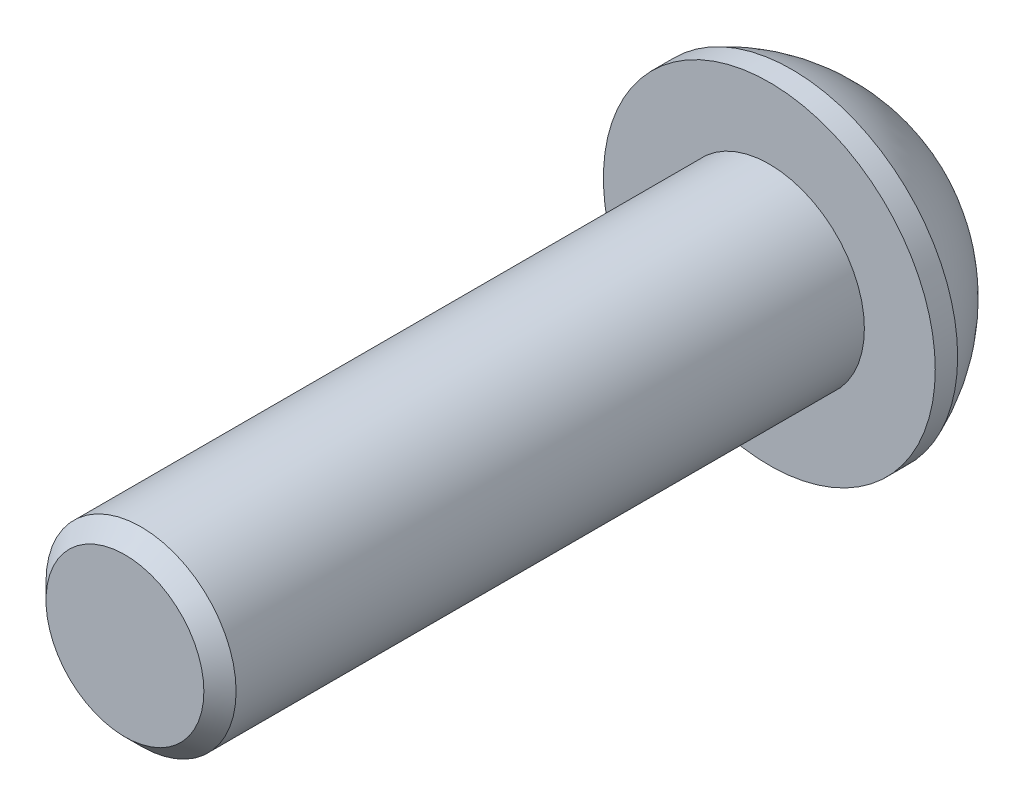
ISO-10303-21;
HEADER;
FILE_DESCRIPTION(('STEP AP214'),'2;1');
FILE_NAME('part.step','',(''),(''),'','','');
FILE_SCHEMA(('AUTOMOTIVE_DESIGN { 1 0 10303 214 1 1 1 1 }'));
ENDSEC;
DATA;
#1=APPLICATION_CONTEXT('core data for automotive mechanical design processes');
#2=APPLICATION_PROTOCOL_DEFINITION('international standard','automotive_design',2000,#1);
#3=PRODUCT_CONTEXT('',#1,'mechanical');
#4=PRODUCT('Part','Part','',(#3));
#5=PRODUCT_RELATED_PRODUCT_CATEGORY('part','',(#4));
#6=PRODUCT_DEFINITION_FORMATION('','',#4);
#7=PRODUCT_DEFINITION_CONTEXT('part definition',#1,'design');
#8=PRODUCT_DEFINITION('design','',#6,#7);
#9=PRODUCT_DEFINITION_SHAPE('','',#8);
#10=(LENGTH_UNIT() NAMED_UNIT(*) SI_UNIT(.MILLI.,.METRE.));
#11=(NAMED_UNIT(*) PLANE_ANGLE_UNIT() SI_UNIT($,.RADIAN.));
#12=(NAMED_UNIT(*) SI_UNIT($,.STERADIAN.) SOLID_ANGLE_UNIT());
#13=UNCERTAINTY_MEASURE_WITH_UNIT(LENGTH_MEASURE(1.E-05),#10,'distance_accuracy_value','');
#14=(GEOMETRIC_REPRESENTATION_CONTEXT(3) GLOBAL_UNCERTAINTY_ASSIGNED_CONTEXT((#13)) GLOBAL_UNIT_ASSIGNED_CONTEXT((#10,
#11,#12)) REPRESENTATION_CONTEXT('',''));
#15=CARTESIAN_POINT('',(0.,0.,0.));
#16=DIRECTION('',(0.,0.,1.));
#17=DIRECTION('',(1.,0.,0.));
#18=AXIS2_PLACEMENT_3D('',#15,#16,#17);
#19=CARTESIAN_POINT('',(0.,0.,20.));
#20=DIRECTION('',(0.,0.,-1.));
#21=DIRECTION('',(-1.,0.,0.));
#22=AXIS2_PLACEMENT_3D('',#19,#20,#21);
#23=CYLINDRICAL_SURFACE('',#22,2.95);
#24=CARTESIAN_POINT('',(0.,0.,19.5));
#25=DIRECTION('',(0.,0.,1.));
#26=DIRECTION('',(1.,0.,0.));
#27=AXIS2_PLACEMENT_3D('',#24,#25,#26);
#28=CIRCLE('',#27,2.95);
#29=CARTESIAN_POINT('',(2.95,0.,19.5));
#30=VERTEX_POINT('',#29);
#31=EDGE_CURVE('E11',#30,#30,#28,.F.);
#32=ORIENTED_EDGE('',*,*,#31,.T.);
#33=EDGE_LOOP('',(#32));
#34=FACE_BOUND('',#33,.T.);
#35=CARTESIAN_POINT('',(0.,0.,0.));
#36=DIRECTION('',(0.,0.,1.));
#37=DIRECTION('',(1.,0.,0.));
#38=AXIS2_PLACEMENT_3D('',#35,#36,#37);
#39=CIRCLE('',#38,2.95);
#40=CARTESIAN_POINT('',(2.95,0.,0.));
#41=VERTEX_POINT('',#40);
#42=EDGE_CURVE('E167',#41,#41,#39,.T.);
#43=ORIENTED_EDGE('',*,*,#42,.T.);
#44=EDGE_LOOP('',(#43));
#45=FACE_BOUND('',#44,.T.);
#46=ADVANCED_FACE('F38',(#34,#45),#23,.T.);
#47=CARTESIAN_POINT('',(0.,0.,20.));
#48=DIRECTION('',(0.,0.,1.));
#49=DIRECTION('',(1.,0.,0.));
#50=AXIS2_PLACEMENT_3D('',#47,#48,#49);
#51=PLANE('',#50);
#52=CARTESIAN_POINT('',(0.,0.,20.));
#53=DIRECTION('',(0.,0.,1.));
#54=DIRECTION('',(1.,0.,0.));
#55=AXIS2_PLACEMENT_3D('',#52,#53,#54);
#56=CIRCLE('',#55,2.45);
#57=CARTESIAN_POINT('',(2.45,0.,20.));
#58=VERTEX_POINT('',#57);
#59=EDGE_CURVE('E48',#58,#58,#56,.T.);
#60=ORIENTED_EDGE('',*,*,#59,.T.);
#61=EDGE_LOOP('',(#60));
#62=FACE_BOUND('',#61,.T.);
#63=ADVANCED_FACE('F173',(#62),#51,.T.);
#64=CARTESIAN_POINT('',(0.,0.,-3.25));
#65=DIRECTION('',(0.,0.,1.));
#66=DIRECTION('',(1.,0.,0.));
#67=AXIS2_PLACEMENT_3D('',#64,#65,#66);
#68=PLANE('',#67);
#69=DIRECTION('',(0.866025403784439,0.5,0.));
#70=VECTOR('',#69,1.);
#71=CARTESIAN_POINT('',(-2.,1.15470053837925,-3.25));
#72=LINE('',#71,#70);
#73=CARTESIAN_POINT('',(-2.,1.15470053837925,-3.25));
#74=VERTEX_POINT('',#73);
#75=CARTESIAN_POINT('',(0.,2.3094010767585,-3.25));
#76=VERTEX_POINT('',#75);
#77=EDGE_CURVE('E132',#74,#76,#72,.T.);
#78=ORIENTED_EDGE('',*,*,#77,.F.);
#79=DIRECTION('',(0.,1.,0.));
#80=VECTOR('',#79,1.);
#81=CARTESIAN_POINT('',(-2.,-1.15470053837925,-3.25));
#82=LINE('',#81,#80);
#83=CARTESIAN_POINT('',(-2.,-1.15470053837925,-3.25));
#84=VERTEX_POINT('',#83);
#85=EDGE_CURVE('E55',#84,#74,#82,.T.);
#86=ORIENTED_EDGE('',*,*,#85,.F.);
#87=DIRECTION('',(-0.866025403784439,0.5,0.));
#88=VECTOR('',#87,1.);
#89=CARTESIAN_POINT('',(0.,-2.3094010767585,-3.25));
#90=LINE('',#89,#88);
#91=CARTESIAN_POINT('',(0.,-2.3094010767585,-3.25));
#92=VERTEX_POINT('',#91);
#93=EDGE_CURVE('E143',#92,#84,#90,.T.);
#94=ORIENTED_EDGE('',*,*,#93,.F.);
#95=DIRECTION('',(-0.866025403784439,-0.5,0.));
#96=VECTOR('',#95,1.);
#97=CARTESIAN_POINT('',(2.,-1.15470053837925,-3.25));
#98=LINE('',#97,#96);
#99=CARTESIAN_POINT('',(2.,-1.15470053837925,-3.25));
#100=VERTEX_POINT('',#99);
#101=EDGE_CURVE('E141',#100,#92,#98,.T.);
#102=ORIENTED_EDGE('',*,*,#101,.F.);
#103=DIRECTION('',(0.,-1.,0.));
#104=VECTOR('',#103,1.);
#105=CARTESIAN_POINT('',(2.,1.15470053837925,-3.25));
#106=LINE('',#105,#104);
#107=CARTESIAN_POINT('',(2.,1.15470053837925,-3.25));
#108=VERTEX_POINT('',#107);
#109=EDGE_CURVE('E103',#108,#100,#106,.T.);
#110=ORIENTED_EDGE('',*,*,#109,.F.);
#111=DIRECTION('',(0.866025403784439,-0.5,0.));
#112=VECTOR('',#111,1.);
#113=CARTESIAN_POINT('',(0.,2.3094010767585,-3.25));
#114=LINE('',#113,#112);
#115=EDGE_CURVE('E135',#76,#108,#114,.T.);
#116=ORIENTED_EDGE('',*,*,#115,.F.);
#117=EDGE_LOOP('',(#78,#86,#94,#102,#110,#116));
#118=FACE_BOUND('',#117,.T.);
#119=CARTESIAN_POINT('',(0.,0.,-3.25));
#120=DIRECTION('',(0.,0.,1.));
#121=DIRECTION('',(1.,0.,0.));
#122=AXIS2_PLACEMENT_3D('',#119,#120,#121);
#123=CIRCLE('',#122,3.1);
#124=CARTESIAN_POINT('',(3.1,0.,-3.25));
#125=VERTEX_POINT('',#124);
#126=EDGE_CURVE('E163',#125,#125,#123,.T.);
#127=ORIENTED_EDGE('',*,*,#126,.F.);
#128=EDGE_LOOP('',(#127));
#129=FACE_BOUND('',#128,.T.);
#130=ADVANCED_FACE('F194',(#118,#129),#68,.F.);
#131=CARTESIAN_POINT('',(0.,0.,1.45920461864541));
#132=DIRECTION('',(0.,0.,1.));
#133=DIRECTION('',(1.,0.,0.));
#134=AXIS2_PLACEMENT_3D('',#131,#132,#133);
#135=DEGENERATE_TOROIDAL_SURFACE('',#134,0.151872843670567,5.72287385250394,.F.);
#136=CARTESIAN_POINT('',(0.,0.,-0.695193088655151));
#137=DIRECTION('',(0.,0.,1.));
#138=DIRECTION('',(1.,0.,0.));
#139=AXIS2_PLACEMENT_3D('',#136,#137,#138);
#140=CIRCLE('',#139,5.15);
#141=CARTESIAN_POINT('',(5.15,0.,-0.695193088655151));
#142=VERTEX_POINT('',#141);
#143=EDGE_CURVE('E159',#142,#142,#140,.T.);
#144=ORIENTED_EDGE('',*,*,#143,.F.);
#145=EDGE_LOOP('',(#144));
#146=FACE_BOUND('',#145,.T.);
#147=ORIENTED_EDGE('',*,*,#126,.T.);
#148=EDGE_LOOP('',(#147));
#149=FACE_BOUND('',#148,.T.);
#150=ADVANCED_FACE('F200',(#146,#149),#135,.F.);
#151=CARTESIAN_POINT('',(0.,0.,0.));
#152=DIRECTION('',(0.,0.,1.));
#153=DIRECTION('',(1.,0.,0.));
#154=AXIS2_PLACEMENT_3D('',#151,#152,#153);
#155=CYLINDRICAL_SURFACE('',#154,5.15);
#156=ORIENTED_EDGE('',*,*,#143,.T.);
#157=EDGE_LOOP('',(#156));
#158=FACE_BOUND('',#157,.T.);
#159=CARTESIAN_POINT('',(0.,0.,0.));
#160=DIRECTION('',(0.,0.,1.));
#161=DIRECTION('',(1.,0.,0.));
#162=AXIS2_PLACEMENT_3D('',#159,#160,#161);
#163=CIRCLE('',#162,5.15);
#164=CARTESIAN_POINT('',(5.15,0.,0.));
#165=VERTEX_POINT('',#164);
#166=EDGE_CURVE('E147',#165,#165,#163,.T.);
#167=ORIENTED_EDGE('',*,*,#166,.F.);
#168=EDGE_LOOP('',(#167));
#169=FACE_BOUND('',#168,.T.);
#170=ADVANCED_FACE('F185',(#158,#169),#155,.T.);
#171=CARTESIAN_POINT('',(0.,0.,0.));
#172=DIRECTION('',(0.,0.,1.));
#173=DIRECTION('',(1.,0.,0.));
#174=AXIS2_PLACEMENT_3D('',#171,#172,#173);
#175=PLANE('',#174);
#176=ORIENTED_EDGE('',*,*,#42,.F.);
#177=EDGE_LOOP('',(#176));
#178=FACE_BOUND('',#177,.T.);
#179=ORIENTED_EDGE('',*,*,#166,.T.);
#180=EDGE_LOOP('',(#179));
#181=FACE_BOUND('',#180,.T.);
#182=ADVANCED_FACE('F177',(#178,#181),#175,.T.);
#183=CARTESIAN_POINT('',(0.,0.,20.));
#184=DIRECTION('',(0.,0.,-1.));
#185=DIRECTION('',(-1.,0.,0.));
#186=AXIS2_PLACEMENT_3D('',#183,#184,#185);
#187=CONICAL_SURFACE('',#186,2.45,0.785398163397444);
#188=ORIENTED_EDGE('',*,*,#31,.F.);
#189=EDGE_LOOP('',(#188));
#190=FACE_BOUND('',#189,.T.);
#191=ORIENTED_EDGE('',*,*,#59,.F.);
#192=EDGE_LOOP('',(#191));
#193=FACE_BOUND('',#192,.T.);
#194=ADVANCED_FACE('F41',(#190,#193),#187,.T.);
#195=CARTESIAN_POINT('',(-2.,-1.15470053837925,-0.25));
#196=DIRECTION('',(-1.,0.,0.));
#197=DIRECTION('',(0.,-1.,0.));
#198=AXIS2_PLACEMENT_3D('',#195,#196,#197);
#199=PLANE('',#198);
#200=ORIENTED_EDGE('',*,*,#85,.T.);
#201=DIRECTION('',(0.,0.,-1.));
#202=VECTOR('',#201,1.);
#203=CARTESIAN_POINT('',(-2.,1.15470053837925,-0.25));
#204=LINE('',#203,#202);
#205=CARTESIAN_POINT('',(-2.,1.15470053837925,-0.25));
#206=VERTEX_POINT('',#205);
#207=EDGE_CURVE('E85',#206,#74,#204,.T.);
#208=ORIENTED_EDGE('',*,*,#207,.F.);
#209=DIRECTION('',(0.,1.,0.));
#210=VECTOR('',#209,1.);
#211=CARTESIAN_POINT('',(-2.,-1.15470053837925,-0.25));
#212=LINE('',#211,#210);
#213=CARTESIAN_POINT('',(-2.,-1.15470053837925,-0.25));
#214=VERTEX_POINT('',#213);
#215=EDGE_CURVE('E145',#214,#206,#212,.T.);
#216=ORIENTED_EDGE('',*,*,#215,.F.);
#217=DIRECTION('',(0.,0.,-1.));
#218=VECTOR('',#217,1.);
#219=CARTESIAN_POINT('',(-2.,-1.15470053837925,-0.25));
#220=LINE('',#219,#218);
#221=EDGE_CURVE('E63',#214,#84,#220,.T.);
#222=ORIENTED_EDGE('',*,*,#221,.T.);
#223=EDGE_LOOP('',(#200,#208,#216,#222));
#224=FACE_BOUND('',#223,.T.);
#225=ADVANCED_FACE('F176',(#224),#199,.F.);
#226=CARTESIAN_POINT('',(0.,-2.3094010767585,-0.25));
#227=DIRECTION('',(-0.5,-0.866025403784439,0.));
#228=DIRECTION('',(0.866025403784439,-0.5,0.));
#229=AXIS2_PLACEMENT_3D('',#226,#227,#228);
#230=PLANE('',#229);
#231=ORIENTED_EDGE('',*,*,#93,.T.);
#232=ORIENTED_EDGE('',*,*,#221,.F.);
#233=DIRECTION('',(-0.866025403784439,0.5,0.));
#234=VECTOR('',#233,1.);
#235=CARTESIAN_POINT('',(0.,-2.3094010767585,-0.25));
#236=LINE('',#235,#234);
#237=CARTESIAN_POINT('',(0.,-2.3094010767585,-0.25));
#238=VERTEX_POINT('',#237);
#239=EDGE_CURVE('E117',#238,#214,#236,.T.);
#240=ORIENTED_EDGE('',*,*,#239,.F.);
#241=DIRECTION('',(0.,0.,-1.));
#242=VECTOR('',#241,1.);
#243=CARTESIAN_POINT('',(0.,-2.3094010767585,-0.25));
#244=LINE('',#243,#242);
#245=EDGE_CURVE('E108',#238,#92,#244,.T.);
#246=ORIENTED_EDGE('',*,*,#245,.T.);
#247=EDGE_LOOP('',(#231,#232,#240,#246));
#248=FACE_BOUND('',#247,.T.);
#249=ADVANCED_FACE('F183',(#248),#230,.F.);
#250=CARTESIAN_POINT('',(2.,-1.15470053837925,-0.25));
#251=DIRECTION('',(0.5,-0.866025403784439,0.));
#252=DIRECTION('',(0.866025403784439,0.5,0.));
#253=AXIS2_PLACEMENT_3D('',#250,#251,#252);
#254=PLANE('',#253);
#255=ORIENTED_EDGE('',*,*,#101,.T.);
#256=ORIENTED_EDGE('',*,*,#245,.F.);
#257=DIRECTION('',(-0.866025403784439,-0.5,0.));
#258=VECTOR('',#257,1.);
#259=CARTESIAN_POINT('',(2.,-1.15470053837925,-0.25));
#260=LINE('',#259,#258);
#261=CARTESIAN_POINT('',(2.,-1.15470053837925,-0.25));
#262=VERTEX_POINT('',#261);
#263=EDGE_CURVE('E112',#262,#238,#260,.T.);
#264=ORIENTED_EDGE('',*,*,#263,.F.);
#265=DIRECTION('',(0.,0.,-1.));
#266=VECTOR('',#265,1.);
#267=CARTESIAN_POINT('',(2.,-1.15470053837925,-0.25));
#268=LINE('',#267,#266);
#269=EDGE_CURVE('E96',#262,#100,#268,.T.);
#270=ORIENTED_EDGE('',*,*,#269,.T.);
#271=EDGE_LOOP('',(#255,#256,#264,#270));
#272=FACE_BOUND('',#271,.T.);
#273=ADVANCED_FACE('F113',(#272),#254,.F.);
#274=CARTESIAN_POINT('',(2.,1.15470053837925,-0.25));
#275=DIRECTION('',(1.,0.,0.));
#276=DIRECTION('',(0.,1.,0.));
#277=AXIS2_PLACEMENT_3D('',#274,#275,#276);
#278=PLANE('',#277);
#279=ORIENTED_EDGE('',*,*,#109,.T.);
#280=ORIENTED_EDGE('',*,*,#269,.F.);
#281=DIRECTION('',(0.,-1.,0.));
#282=VECTOR('',#281,1.);
#283=CARTESIAN_POINT('',(2.,1.15470053837925,-0.25));
#284=LINE('',#283,#282);
#285=CARTESIAN_POINT('',(2.,1.15470053837925,-0.25));
#286=VERTEX_POINT('',#285);
#287=EDGE_CURVE('E100',#286,#262,#284,.T.);
#288=ORIENTED_EDGE('',*,*,#287,.F.);
#289=DIRECTION('',(0.,0.,-1.));
#290=VECTOR('',#289,1.);
#291=CARTESIAN_POINT('',(2.,1.15470053837925,-0.25));
#292=LINE('',#291,#290);
#293=EDGE_CURVE('E109',#286,#108,#292,.T.);
#294=ORIENTED_EDGE('',*,*,#293,.T.);
#295=EDGE_LOOP('',(#279,#280,#288,#294));
#296=FACE_BOUND('',#295,.T.);
#297=ADVANCED_FACE('F98',(#296),#278,.F.);
#298=CARTESIAN_POINT('',(0.,2.3094010767585,-0.25));
#299=DIRECTION('',(0.5,0.866025403784439,0.));
#300=DIRECTION('',(-0.866025403784439,0.5,0.));
#301=AXIS2_PLACEMENT_3D('',#298,#299,#300);
#302=PLANE('',#301);
#303=ORIENTED_EDGE('',*,*,#115,.T.);
#304=ORIENTED_EDGE('',*,*,#293,.F.);
#305=DIRECTION('',(0.866025403784439,-0.5,0.));
#306=VECTOR('',#305,1.);
#307=CARTESIAN_POINT('',(0.,2.3094010767585,-0.25));
#308=LINE('',#307,#306);
#309=CARTESIAN_POINT('',(0.,2.3094010767585,-0.25));
#310=VERTEX_POINT('',#309);
#311=EDGE_CURVE('E123',#310,#286,#308,.T.);
#312=ORIENTED_EDGE('',*,*,#311,.F.);
#313=DIRECTION('',(0.,0.,-1.));
#314=VECTOR('',#313,1.);
#315=CARTESIAN_POINT('',(0.,2.3094010767585,-0.25));
#316=LINE('',#315,#314);
#317=EDGE_CURVE('E151',#310,#76,#316,.T.);
#318=ORIENTED_EDGE('',*,*,#317,.T.);
#319=EDGE_LOOP('',(#303,#304,#312,#318));
#320=FACE_BOUND('',#319,.T.);
#321=ADVANCED_FACE('F211',(#320),#302,.F.);
#322=CARTESIAN_POINT('',(-2.,1.15470053837925,-0.25));
#323=DIRECTION('',(-0.5,0.866025403784439,0.));
#324=DIRECTION('',(-0.866025403784439,-0.5,0.));
#325=AXIS2_PLACEMENT_3D('',#322,#323,#324);
#326=PLANE('',#325);
#327=ORIENTED_EDGE('',*,*,#77,.T.);
#328=ORIENTED_EDGE('',*,*,#317,.F.);
#329=DIRECTION('',(0.866025403784439,0.5,0.));
#330=VECTOR('',#329,1.);
#331=CARTESIAN_POINT('',(-2.,1.15470053837925,-0.25));
#332=LINE('',#331,#330);
#333=EDGE_CURVE('E125',#206,#310,#332,.T.);
#334=ORIENTED_EDGE('',*,*,#333,.F.);
#335=ORIENTED_EDGE('',*,*,#207,.T.);
#336=EDGE_LOOP('',(#327,#328,#334,#335));
#337=FACE_BOUND('',#336,.T.);
#338=ADVANCED_FACE('F208',(#337),#326,.F.);
#339=CARTESIAN_POINT('',(0.,0.,-0.25));
#340=DIRECTION('',(0.,0.,-1.));
#341=DIRECTION('',(-1.,0.,0.));
#342=AXIS2_PLACEMENT_3D('',#339,#340,#341);
#343=PLANE('',#342);
#344=ORIENTED_EDGE('',*,*,#215,.T.);
#345=ORIENTED_EDGE('',*,*,#333,.T.);
#346=ORIENTED_EDGE('',*,*,#311,.T.);
#347=ORIENTED_EDGE('',*,*,#287,.T.);
#348=ORIENTED_EDGE('',*,*,#263,.T.);
#349=ORIENTED_EDGE('',*,*,#239,.T.);
#350=EDGE_LOOP('',(#344,#345,#346,#347,#348,#349));
#351=FACE_BOUND('',#350,.T.);
#352=ADVANCED_FACE('F120',(#351),#343,.T.);
#353=CLOSED_SHELL('',(#46,#63,#130,#150,#170,#182,#194,#225,#249,#273,#297,#321,#338,#352));
#354=MANIFOLD_SOLID_BREP('B2',#353);
#355=ADVANCED_BREP_SHAPE_REPRESENTATION('',(#18,#354),#14);
#356=SHAPE_DEFINITION_REPRESENTATION(#9,#355);
ENDSEC;
END-ISO-10303-21;
